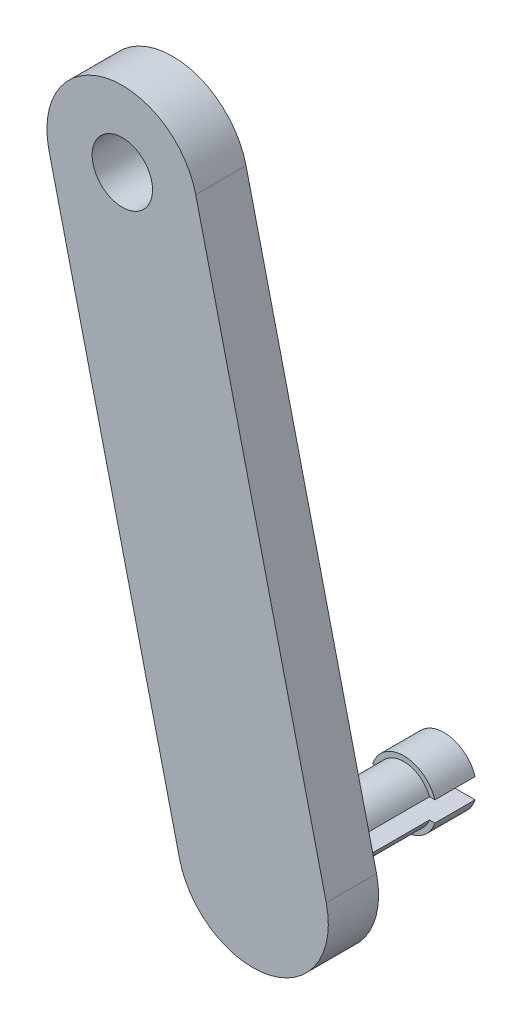
ISO-10303-21;
HEADER;
FILE_DESCRIPTION(('STEP AP214'),'2;1');
FILE_NAME('part.step','',(''),(''),'','','');
FILE_SCHEMA(('AUTOMOTIVE_DESIGN { 1 0 10303 214 1 1 1 1 }'));
ENDSEC;
DATA;
#1=APPLICATION_CONTEXT('core data for automotive mechanical design processes');
#2=APPLICATION_PROTOCOL_DEFINITION('international standard','automotive_design',2000,#1);
#3=PRODUCT_CONTEXT('',#1,'mechanical');
#4=PRODUCT('Part','Part','',(#3));
#5=PRODUCT_RELATED_PRODUCT_CATEGORY('part','',(#4));
#6=PRODUCT_DEFINITION_FORMATION('','',#4);
#7=PRODUCT_DEFINITION_CONTEXT('part definition',#1,'design');
#8=PRODUCT_DEFINITION('design','',#6,#7);
#9=PRODUCT_DEFINITION_SHAPE('','',#8);
#10=(LENGTH_UNIT() NAMED_UNIT(*) SI_UNIT(.MILLI.,.METRE.));
#11=(NAMED_UNIT(*) PLANE_ANGLE_UNIT() SI_UNIT($,.RADIAN.));
#12=(NAMED_UNIT(*) SI_UNIT($,.STERADIAN.) SOLID_ANGLE_UNIT());
#13=UNCERTAINTY_MEASURE_WITH_UNIT(LENGTH_MEASURE(1.E-05),#10,'distance_accuracy_value','');
#14=(GEOMETRIC_REPRESENTATION_CONTEXT(3) GLOBAL_UNCERTAINTY_ASSIGNED_CONTEXT((#13)) GLOBAL_UNIT_ASSIGNED_CONTEXT((#10,
#11,#12)) REPRESENTATION_CONTEXT('',''));
#15=CARTESIAN_POINT('',(0.,0.,0.));
#16=DIRECTION('',(0.,0.,1.));
#17=DIRECTION('',(1.,0.,0.));
#18=AXIS2_PLACEMENT_3D('',#15,#16,#17);
#19=CARTESIAN_POINT('',(-51.0249465194106,-58.4761230923773,-10.));
#20=DIRECTION('',(0.,0.,1.));
#21=DIRECTION('',(1.,0.,0.));
#22=AXIS2_PLACEMENT_3D('',#19,#20,#21);
#23=CYLINDRICAL_SURFACE('',#22,2.75000000000001);
#24=DIRECTION('',(0.,0.,1.));
#25=VECTOR('',#24,1.);
#26=CARTESIAN_POINT('',(-53.5866842109005,-57.4761230923773,-10.));
#27=LINE('',#26,#25);
#28=CARTESIAN_POINT('',(-53.5866842109005,-57.4761230923773,0.));
#29=VERTEX_POINT('',#28);
#30=CARTESIAN_POINT('',(-53.5866842109005,-57.4761230923773,-10.));
#31=VERTEX_POINT('',#30);
#32=EDGE_CURVE('E164',#29,#31,#27,.F.);
#33=ORIENTED_EDGE('',*,*,#32,.F.);
#34=CARTESIAN_POINT('',(-51.0249465194106,-58.4761230923773,0.));
#35=DIRECTION('',(0.,0.,1.));
#36=DIRECTION('',(1.,0.,0.));
#37=AXIS2_PLACEMENT_3D('',#34,#35,#36);
#38=CIRCLE('',#37,2.75000000000001);
#39=CARTESIAN_POINT('',(-48.4632088279207,-57.4761230923773,0.));
#40=VERTEX_POINT('',#39);
#41=EDGE_CURVE('E182',#40,#29,#38,.T.);
#42=ORIENTED_EDGE('',*,*,#41,.F.);
#43=DIRECTION('',(0.,0.,1.));
#44=VECTOR('',#43,1.);
#45=CARTESIAN_POINT('',(-48.4632088279207,-57.4761230923773,-10.));
#46=LINE('',#45,#44);
#47=CARTESIAN_POINT('',(-48.4632088279207,-57.4761230923773,-10.));
#48=VERTEX_POINT('',#47);
#49=EDGE_CURVE('E222',#48,#40,#46,.T.);
#50=ORIENTED_EDGE('',*,*,#49,.F.);
#51=CARTESIAN_POINT('',(-51.0249465194106,-58.4761230923773,-10.));
#52=DIRECTION('',(0.,0.,1.));
#53=DIRECTION('',(1.,0.,0.));
#54=AXIS2_PLACEMENT_3D('',#51,#52,#53);
#55=CIRCLE('',#54,2.75000000000001);
#56=EDGE_CURVE('E167',#48,#31,#55,.T.);
#57=ORIENTED_EDGE('',*,*,#56,.T.);
#58=EDGE_LOOP('',(#33,#42,#50,#57));
#59=FACE_BOUND('',#58,.T.);
#60=ADVANCED_FACE('F37',(#59),#23,.T.);
#61=CARTESIAN_POINT('',(-51.0249465194106,-58.4761230923773,-14.));
#62=DIRECTION('',(0.,0.,1.));
#63=DIRECTION('',(1.,0.,0.));
#64=AXIS2_PLACEMENT_3D('',#61,#62,#63);
#65=CYLINDRICAL_SURFACE('',#64,3.25000000000001);
#66=CARTESIAN_POINT('',(-51.0249465194106,-58.4761230923773,-14.));
#67=DIRECTION('',(0.,0.,-1.));
#68=DIRECTION('',(-1.,0.,0.));
#69=AXIS2_PLACEMENT_3D('',#66,#67,#68);
#70=CIRCLE('',#69,3.25000000000001);
#71=CARTESIAN_POINT('',(-54.1172757386239,-57.4761230923773,-14.));
#72=VERTEX_POINT('',#71);
#73=CARTESIAN_POINT('',(-47.9326173001974,-57.4761230923773,-14.));
#74=VERTEX_POINT('',#73);
#75=EDGE_CURVE('E155',#72,#74,#70,.T.);
#76=ORIENTED_EDGE('',*,*,#75,.F.);
#77=DIRECTION('',(0.,0.,1.));
#78=VECTOR('',#77,1.);
#79=CARTESIAN_POINT('',(-54.1172757386239,-57.4761230923773,-14.));
#80=LINE('',#79,#78);
#81=CARTESIAN_POINT('',(-54.1172757386239,-57.4761230923773,-10.));
#82=VERTEX_POINT('',#81);
#83=EDGE_CURVE('E223',#72,#82,#80,.T.);
#84=ORIENTED_EDGE('',*,*,#83,.T.);
#85=CARTESIAN_POINT('',(-51.0249465194106,-58.4761230923773,-10.));
#86=DIRECTION('',(0.,0.,-1.));
#87=DIRECTION('',(-1.,0.,0.));
#88=AXIS2_PLACEMENT_3D('',#85,#86,#87);
#89=CIRCLE('',#88,3.25000000000001);
#90=CARTESIAN_POINT('',(-47.9326173001974,-57.4761230923773,-10.));
#91=VERTEX_POINT('',#90);
#92=EDGE_CURVE('E156',#82,#91,#89,.T.);
#93=ORIENTED_EDGE('',*,*,#92,.T.);
#94=DIRECTION('',(0.,0.,1.));
#95=VECTOR('',#94,1.);
#96=CARTESIAN_POINT('',(-47.9326173001974,-57.4761230923773,-14.));
#97=LINE('',#96,#95);
#98=EDGE_CURVE('E219',#91,#74,#97,.F.);
#99=ORIENTED_EDGE('',*,*,#98,.T.);
#100=EDGE_LOOP('',(#76,#84,#93,#99));
#101=FACE_BOUND('',#100,.T.);
#102=ADVANCED_FACE('F244',(#101),#65,.T.);
#103=CARTESIAN_POINT('',(-51.0249465194106,-58.4761230923773,-14.));
#104=DIRECTION('',(0.,0.,-1.));
#105=DIRECTION('',(-1.,0.,0.));
#106=AXIS2_PLACEMENT_3D('',#103,#104,#105);
#107=PLANE('',#106);
#108=DIRECTION('',(1.,0.,0.));
#109=VECTOR('',#108,1.);
#110=CARTESIAN_POINT('',(-46.0249465194106,-57.4761230923773,-14.));
#111=LINE('',#110,#109);
#112=EDGE_CURVE('E152',#72,#74,#111,.T.);
#113=ORIENTED_EDGE('',*,*,#112,.F.);
#114=ORIENTED_EDGE('',*,*,#75,.T.);
#115=EDGE_LOOP('',(#113,#114));
#116=FACE_BOUND('',#115,.T.);
#117=ADVANCED_FACE('F245',(#116),#107,.T.);
#118=CARTESIAN_POINT('',(-51.0249465194106,-58.4761230923773,-10.));
#119=DIRECTION('',(0.,0.,-1.));
#120=DIRECTION('',(-1.,0.,0.));
#121=AXIS2_PLACEMENT_3D('',#118,#119,#120);
#122=PLANE('',#121);
#123=ORIENTED_EDGE('',*,*,#92,.F.);
#124=DIRECTION('',(1.,0.,0.));
#125=VECTOR('',#124,1.);
#126=CARTESIAN_POINT('',(-51.0249465194106,-57.4761230923773,-10.));
#127=LINE('',#126,#125);
#128=EDGE_CURVE('E11',#82,#31,#127,.T.);
#129=ORIENTED_EDGE('',*,*,#128,.T.);
#130=ORIENTED_EDGE('',*,*,#56,.F.);
#131=EDGE_CURVE('E46',#48,#91,#127,.T.);
#132=ORIENTED_EDGE('',*,*,#131,.T.);
#133=EDGE_LOOP('',(#123,#129,#130,#132));
#134=FACE_BOUND('',#133,.T.);
#135=ADVANCED_FACE('F233',(#134),#122,.F.);
#136=CARTESIAN_POINT('',(-64.,-4.,5.));
#137=DIRECTION('',(0.,0.,-1.));
#138=DIRECTION('',(-1.,0.,0.));
#139=AXIS2_PLACEMENT_3D('',#136,#137,#138);
#140=CYLINDRICAL_SURFACE('',#139,7.49999999999998);
#141=CARTESIAN_POINT('',(-64.,-4.,0.));
#142=DIRECTION('',(0.,0.,1.));
#143=DIRECTION('',(1.,0.,0.));
#144=AXIS2_PLACEMENT_3D('',#141,#142,#143);
#145=CIRCLE('',#144,7.49999999999998);
#146=CARTESIAN_POINT('',(-56.7040906572709,-2.26226962313535,0.));
#147=VERTEX_POINT('',#146);
#148=CARTESIAN_POINT('',(-71.2959093427291,-5.73773037686465,0.));
#149=VERTEX_POINT('',#148);
#150=EDGE_CURVE('E178',#147,#149,#145,.T.);
#151=ORIENTED_EDGE('',*,*,#150,.T.);
#152=DIRECTION('',(0.,0.,-1.));
#153=VECTOR('',#152,1.);
#154=CARTESIAN_POINT('',(-71.2959093427291,-5.73773037686465,5.));
#155=LINE('',#154,#153);
#156=CARTESIAN_POINT('',(-71.2959093427291,-5.73773037686465,5.));
#157=VERTEX_POINT('',#156);
#158=EDGE_CURVE('E193',#157,#149,#155,.T.);
#159=ORIENTED_EDGE('',*,*,#158,.F.);
#160=CARTESIAN_POINT('',(-64.,-4.,5.));
#161=DIRECTION('',(0.,0.,1.));
#162=DIRECTION('',(1.,0.,0.));
#163=AXIS2_PLACEMENT_3D('',#160,#161,#162);
#164=CIRCLE('',#163,7.49999999999998);
#165=CARTESIAN_POINT('',(-56.7040906572709,-2.26226962313535,5.));
#166=VERTEX_POINT('',#165);
#167=EDGE_CURVE('E171',#166,#157,#164,.T.);
#168=ORIENTED_EDGE('',*,*,#167,.F.);
#169=DIRECTION('',(0.,0.,-1.));
#170=VECTOR('',#169,1.);
#171=CARTESIAN_POINT('',(-56.7040906572709,-2.26226962313535,5.));
#172=LINE('',#171,#170);
#173=EDGE_CURVE('E177',#166,#147,#172,.T.);
#174=ORIENTED_EDGE('',*,*,#173,.T.);
#175=EDGE_LOOP('',(#151,#159,#168,#174));
#176=FACE_BOUND('',#175,.T.);
#177=ADVANCED_FACE('F39',(#176),#140,.T.);
#178=CARTESIAN_POINT('',(-71.2959093427291,-5.73773037686465,5.));
#179=DIRECTION('',(0.972787912363881,0.231697383581954,0.));
#180=DIRECTION('',(-0.231697383581954,0.972787912363881,0.));
#181=AXIS2_PLACEMENT_3D('',#178,#179,#180);
#182=PLANE('',#181);
#183=DIRECTION('',(0.231697383581954,-0.972787912363881,0.));
#184=VECTOR('',#183,1.);
#185=CARTESIAN_POINT('',(-71.2959093427291,-5.73773037686465,0.));
#186=LINE('',#185,#184);
#187=CARTESIAN_POINT('',(-58.3208558621397,-60.2138534692419,0.));
#188=VERTEX_POINT('',#187);
#189=EDGE_CURVE('E181',#149,#188,#186,.T.);
#190=ORIENTED_EDGE('',*,*,#189,.T.);
#191=DIRECTION('',(0.,0.,-1.));
#192=VECTOR('',#191,1.);
#193=CARTESIAN_POINT('',(-58.3208558621397,-60.2138534692419,5.));
#194=LINE('',#193,#192);
#195=CARTESIAN_POINT('',(-58.3208558621397,-60.2138534692419,5.));
#196=VERTEX_POINT('',#195);
#197=EDGE_CURVE('E190',#196,#188,#194,.T.);
#198=ORIENTED_EDGE('',*,*,#197,.F.);
#199=DIRECTION('',(0.231697383581954,-0.972787912363881,0.));
#200=VECTOR('',#199,1.);
#201=CARTESIAN_POINT('',(-71.2959093427291,-5.73773037686465,5.));
#202=LINE('',#201,#200);
#203=EDGE_CURVE('E91',#157,#196,#202,.T.);
#204=ORIENTED_EDGE('',*,*,#203,.F.);
#205=ORIENTED_EDGE('',*,*,#158,.T.);
#206=EDGE_LOOP('',(#190,#198,#204,#205));
#207=FACE_BOUND('',#206,.T.);
#208=ADVANCED_FACE('F280',(#207),#182,.F.);
#209=CARTESIAN_POINT('',(-51.0249465194106,-58.4761230923773,5.));
#210=DIRECTION('',(0.,0.,-1.));
#211=DIRECTION('',(-1.,0.,0.));
#212=AXIS2_PLACEMENT_3D('',#209,#210,#211);
#213=CYLINDRICAL_SURFACE('',#212,7.49999999999997);
#214=CARTESIAN_POINT('',(-51.0249465194106,-58.4761230923773,0.));
#215=DIRECTION('',(0.,0.,1.));
#216=DIRECTION('',(1.,0.,0.));
#217=AXIS2_PLACEMENT_3D('',#214,#215,#216);
#218=CIRCLE('',#217,7.49999999999997);
#219=CARTESIAN_POINT('',(-43.7290371766815,-56.7383927155127,0.));
#220=VERTEX_POINT('',#219);
#221=EDGE_CURVE('E184',#188,#220,#218,.T.);
#222=ORIENTED_EDGE('',*,*,#221,.T.);
#223=DIRECTION('',(0.,0.,-1.));
#224=VECTOR('',#223,1.);
#225=CARTESIAN_POINT('',(-43.7290371766815,-56.7383927155127,5.));
#226=LINE('',#225,#224);
#227=CARTESIAN_POINT('',(-43.7290371766815,-56.7383927155127,5.));
#228=VERTEX_POINT('',#227);
#229=EDGE_CURVE('E188',#228,#220,#226,.T.);
#230=ORIENTED_EDGE('',*,*,#229,.F.);
#231=CARTESIAN_POINT('',(-51.0249465194106,-58.4761230923773,5.));
#232=DIRECTION('',(0.,0.,1.));
#233=DIRECTION('',(1.,0.,0.));
#234=AXIS2_PLACEMENT_3D('',#231,#232,#233);
#235=CIRCLE('',#234,7.49999999999997);
#236=EDGE_CURVE('E174',#196,#228,#235,.T.);
#237=ORIENTED_EDGE('',*,*,#236,.F.);
#238=ORIENTED_EDGE('',*,*,#197,.T.);
#239=EDGE_LOOP('',(#222,#230,#237,#238));
#240=FACE_BOUND('',#239,.T.);
#241=ADVANCED_FACE('F278',(#240),#213,.T.);
#242=CARTESIAN_POINT('',(-56.7040906572709,-2.26226962313535,5.));
#243=DIRECTION('',(-0.972787912363881,-0.231697383581953,0.));
#244=DIRECTION('',(0.231697383581953,-0.972787912363881,0.));
#245=AXIS2_PLACEMENT_3D('',#242,#243,#244);
#246=PLANE('',#245);
#247=DIRECTION('',(-0.231697383581953,0.972787912363881,0.));
#248=VECTOR('',#247,1.);
#249=CARTESIAN_POINT('',(-56.7040906572709,-2.26226962313535,0.));
#250=LINE('',#249,#248);
#251=EDGE_CURVE('E83',#220,#147,#250,.T.);
#252=ORIENTED_EDGE('',*,*,#251,.T.);
#253=ORIENTED_EDGE('',*,*,#173,.F.);
#254=DIRECTION('',(-0.231697383581953,0.972787912363881,0.));
#255=VECTOR('',#254,1.);
#256=CARTESIAN_POINT('',(-56.7040906572709,-2.26226962313535,5.));
#257=LINE('',#256,#255);
#258=EDGE_CURVE('E62',#228,#166,#257,.T.);
#259=ORIENTED_EDGE('',*,*,#258,.F.);
#260=ORIENTED_EDGE('',*,*,#229,.T.);
#261=EDGE_LOOP('',(#252,#253,#259,#260));
#262=FACE_BOUND('',#261,.T.);
#263=ADVANCED_FACE('F272',(#262),#246,.F.);
#264=CARTESIAN_POINT('',(-64.,-4.,5.));
#265=DIRECTION('',(0.,0.,1.));
#266=DIRECTION('',(1.,0.,0.));
#267=AXIS2_PLACEMENT_3D('',#264,#265,#266);
#268=PLANE('',#267);
#269=CARTESIAN_POINT('',(-64.,-4.,5.));
#270=DIRECTION('',(0.,0.,1.));
#271=DIRECTION('',(1.,0.,0.));
#272=AXIS2_PLACEMENT_3D('',#269,#270,#271);
#273=CIRCLE('',#272,3.);
#274=CARTESIAN_POINT('',(-61.,-4.,5.));
#275=VERTEX_POINT('',#274);
#276=EDGE_CURVE('E434',#275,#275,#273,.T.);
#277=ORIENTED_EDGE('',*,*,#276,.F.);
#278=EDGE_LOOP('',(#277));
#279=FACE_BOUND('',#278,.T.);
#280=ORIENTED_EDGE('',*,*,#167,.T.);
#281=ORIENTED_EDGE('',*,*,#203,.T.);
#282=ORIENTED_EDGE('',*,*,#236,.T.);
#283=ORIENTED_EDGE('',*,*,#258,.T.);
#284=EDGE_LOOP('',(#280,#281,#282,#283));
#285=FACE_BOUND('',#284,.T.);
#286=ADVANCED_FACE('F266',(#279,#285),#268,.T.);
#287=CARTESIAN_POINT('',(-64.,-4.,0.));
#288=DIRECTION('',(0.,0.,1.));
#289=DIRECTION('',(1.,0.,0.));
#290=AXIS2_PLACEMENT_3D('',#287,#288,#289);
#291=PLANE('',#290);
#292=CARTESIAN_POINT('',(-64.,-4.,0.));
#293=DIRECTION('',(0.,0.,1.));
#294=DIRECTION('',(1.,0.,0.));
#295=AXIS2_PLACEMENT_3D('',#292,#293,#294);
#296=CIRCLE('',#295,3.);
#297=CARTESIAN_POINT('',(-61.,-4.,0.));
#298=VERTEX_POINT('',#297);
#299=EDGE_CURVE('E41',#298,#298,#296,.T.);
#300=ORIENTED_EDGE('',*,*,#299,.T.);
#301=EDGE_LOOP('',(#300));
#302=FACE_BOUND('',#301,.T.);
#303=DIRECTION('',(1.,0.,0.));
#304=VECTOR('',#303,1.);
#305=CARTESIAN_POINT('',(-46.0249465194106,-57.4761230923773,0.));
#306=LINE('',#305,#304);
#307=EDGE_CURVE('E214',#29,#40,#306,.T.);
#308=ORIENTED_EDGE('',*,*,#307,.T.);
#309=ORIENTED_EDGE('',*,*,#41,.T.);
#310=EDGE_LOOP('',(#308,#309));
#311=FACE_BOUND('',#310,.T.);
#312=DIRECTION('',(-1.,0.,0.));
#313=VECTOR('',#312,1.);
#314=CARTESIAN_POINT('',(-46.0249465194106,-59.4761230923773,0.));
#315=LINE('',#314,#313);
#316=CARTESIAN_POINT('',(-48.4632088279207,-59.4761230923773,0.));
#317=VERTEX_POINT('',#316);
#318=CARTESIAN_POINT('',(-53.5866842109005,-59.4761230923773,0.));
#319=VERTEX_POINT('',#318);
#320=EDGE_CURVE('E238',#317,#319,#315,.T.);
#321=ORIENTED_EDGE('',*,*,#320,.T.);
#322=EDGE_CURVE('E170',#319,#317,#38,.T.);
#323=ORIENTED_EDGE('',*,*,#322,.T.);
#324=EDGE_LOOP('',(#321,#323));
#325=FACE_BOUND('',#324,.T.);
#326=ORIENTED_EDGE('',*,*,#150,.F.);
#327=ORIENTED_EDGE('',*,*,#251,.F.);
#328=ORIENTED_EDGE('',*,*,#221,.F.);
#329=ORIENTED_EDGE('',*,*,#189,.F.);
#330=EDGE_LOOP('',(#326,#327,#328,#329));
#331=FACE_BOUND('',#330,.T.);
#332=ADVANCED_FACE('F236',(#302,#311,#325,#331),#291,.F.);
#333=DIRECTION('',(0.,0.,1.));
#334=VECTOR('',#333,1.);
#335=CARTESIAN_POINT('',(-48.4632088279207,-59.4761230923773,-10.));
#336=LINE('',#335,#334);
#337=CARTESIAN_POINT('',(-48.4632088279207,-59.4761230923773,-10.));
#338=VERTEX_POINT('',#337);
#339=EDGE_CURVE('E145',#317,#338,#336,.F.);
#340=ORIENTED_EDGE('',*,*,#339,.F.);
#341=ORIENTED_EDGE('',*,*,#322,.F.);
#342=DIRECTION('',(0.,0.,1.));
#343=VECTOR('',#342,1.);
#344=CARTESIAN_POINT('',(-53.5866842109005,-59.4761230923773,-10.));
#345=LINE('',#344,#343);
#346=CARTESIAN_POINT('',(-53.5866842109005,-59.4761230923773,-10.));
#347=VERTEX_POINT('',#346);
#348=EDGE_CURVE('E146',#347,#319,#345,.T.);
#349=ORIENTED_EDGE('',*,*,#348,.F.);
#350=EDGE_CURVE('E159',#347,#338,#55,.T.);
#351=ORIENTED_EDGE('',*,*,#350,.T.);
#352=EDGE_LOOP('',(#340,#341,#349,#351));
#353=FACE_BOUND('',#352,.T.);
#354=ADVANCED_FACE('F209',(#353),#23,.T.);
#355=CARTESIAN_POINT('',(-47.9326173001974,-59.4761230923773,-14.));
#356=VERTEX_POINT('',#355);
#357=CARTESIAN_POINT('',(-54.1172757386239,-59.4761230923773,-14.));
#358=VERTEX_POINT('',#357);
#359=EDGE_CURVE('E151',#356,#358,#70,.T.);
#360=ORIENTED_EDGE('',*,*,#359,.F.);
#361=DIRECTION('',(0.,0.,1.));
#362=VECTOR('',#361,1.);
#363=CARTESIAN_POINT('',(-47.9326173001974,-59.4761230923773,-14.));
#364=LINE('',#363,#362);
#365=CARTESIAN_POINT('',(-47.9326173001974,-59.4761230923773,-10.));
#366=VERTEX_POINT('',#365);
#367=EDGE_CURVE('E135',#356,#366,#364,.T.);
#368=ORIENTED_EDGE('',*,*,#367,.T.);
#369=CARTESIAN_POINT('',(-54.1172757386239,-59.4761230923773,-10.));
#370=VERTEX_POINT('',#369);
#371=EDGE_CURVE('E161',#366,#370,#89,.T.);
#372=ORIENTED_EDGE('',*,*,#371,.T.);
#373=DIRECTION('',(0.,0.,1.));
#374=VECTOR('',#373,1.);
#375=CARTESIAN_POINT('',(-54.1172757386239,-59.4761230923773,-14.));
#376=LINE('',#375,#374);
#377=EDGE_CURVE('E53',#370,#358,#376,.F.);
#378=ORIENTED_EDGE('',*,*,#377,.T.);
#379=EDGE_LOOP('',(#360,#368,#372,#378));
#380=FACE_BOUND('',#379,.T.);
#381=ADVANCED_FACE('F154',(#380),#65,.T.);
#382=DIRECTION('',(-1.,0.,0.));
#383=VECTOR('',#382,1.);
#384=CARTESIAN_POINT('',(-46.0249465194106,-59.4761230923773,-14.));
#385=LINE('',#384,#383);
#386=EDGE_CURVE('E138',#356,#358,#385,.T.);
#387=ORIENTED_EDGE('',*,*,#386,.F.);
#388=ORIENTED_EDGE('',*,*,#359,.T.);
#389=EDGE_LOOP('',(#387,#388));
#390=FACE_BOUND('',#389,.T.);
#391=ADVANCED_FACE('F150',(#390),#107,.T.);
#392=ORIENTED_EDGE('',*,*,#371,.F.);
#393=DIRECTION('',(-1.,0.,0.));
#394=VECTOR('',#393,1.);
#395=CARTESIAN_POINT('',(-51.0249465194106,-59.4761230923773,-10.));
#396=LINE('',#395,#394);
#397=EDGE_CURVE('E140',#366,#338,#396,.T.);
#398=ORIENTED_EDGE('',*,*,#397,.T.);
#399=ORIENTED_EDGE('',*,*,#350,.F.);
#400=EDGE_CURVE('E195',#347,#370,#396,.T.);
#401=ORIENTED_EDGE('',*,*,#400,.T.);
#402=EDGE_LOOP('',(#392,#398,#399,#401));
#403=FACE_BOUND('',#402,.T.);
#404=ADVANCED_FACE('F205',(#403),#122,.F.);
#405=CARTESIAN_POINT('',(-46.0249465194106,-57.4761230923773,0.));
#406=DIRECTION('',(0.,1.,0.));
#407=DIRECTION('',(0.,0.,1.));
#408=AXIS2_PLACEMENT_3D('',#405,#406,#407);
#409=PLANE('',#408);
#410=ORIENTED_EDGE('',*,*,#32,.T.);
#411=ORIENTED_EDGE('',*,*,#128,.F.);
#412=ORIENTED_EDGE('',*,*,#83,.F.);
#413=ORIENTED_EDGE('',*,*,#112,.T.);
#414=ORIENTED_EDGE('',*,*,#98,.F.);
#415=ORIENTED_EDGE('',*,*,#131,.F.);
#416=ORIENTED_EDGE('',*,*,#49,.T.);
#417=ORIENTED_EDGE('',*,*,#307,.F.);
#418=EDGE_LOOP('',(#410,#411,#412,#413,#414,#415,#416,#417));
#419=FACE_BOUND('',#418,.T.);
#420=ADVANCED_FACE('F229',(#419),#409,.F.);
#421=CARTESIAN_POINT('',(-46.0249465194106,-59.4761230923773,0.));
#422=DIRECTION('',(0.,-1.,0.));
#423=DIRECTION('',(0.,0.,-1.));
#424=AXIS2_PLACEMENT_3D('',#421,#422,#423);
#425=PLANE('',#424);
#426=ORIENTED_EDGE('',*,*,#339,.T.);
#427=ORIENTED_EDGE('',*,*,#397,.F.);
#428=ORIENTED_EDGE('',*,*,#367,.F.);
#429=ORIENTED_EDGE('',*,*,#386,.T.);
#430=ORIENTED_EDGE('',*,*,#377,.F.);
#431=ORIENTED_EDGE('',*,*,#400,.F.);
#432=ORIENTED_EDGE('',*,*,#348,.T.);
#433=ORIENTED_EDGE('',*,*,#320,.F.);
#434=EDGE_LOOP('',(#426,#427,#428,#429,#430,#431,#432,#433));
#435=FACE_BOUND('',#434,.T.);
#436=ADVANCED_FACE('F137',(#435),#425,.F.);
#437=CARTESIAN_POINT('',(-64.,-4.,-9.));
#438=DIRECTION('',(0.,0.,1.));
#439=DIRECTION('',(1.,0.,0.));
#440=AXIS2_PLACEMENT_3D('',#437,#438,#439);
#441=CYLINDRICAL_SURFACE('',#440,3.);
#442=ORIENTED_EDGE('',*,*,#276,.T.);
#443=EDGE_LOOP('',(#442));
#444=FACE_BOUND('',#443,.T.);
#445=ORIENTED_EDGE('',*,*,#299,.F.);
#446=EDGE_LOOP('',(#445));
#447=FACE_BOUND('',#446,.T.);
#448=ADVANCED_FACE('F350',(#444,#447),#441,.F.);
#449=CLOSED_SHELL('',(#60,#102,#117,#135,#177,#208,#241,#263,#286,#332,#354,#381,#391,#404,#420,
#436,#448));
#450=MANIFOLD_SOLID_BREP('B2',#449);
#451=ADVANCED_BREP_SHAPE_REPRESENTATION('',(#18,#450),#14);
#452=SHAPE_DEFINITION_REPRESENTATION(#9,#451);
ENDSEC;
END-ISO-10303-21;
